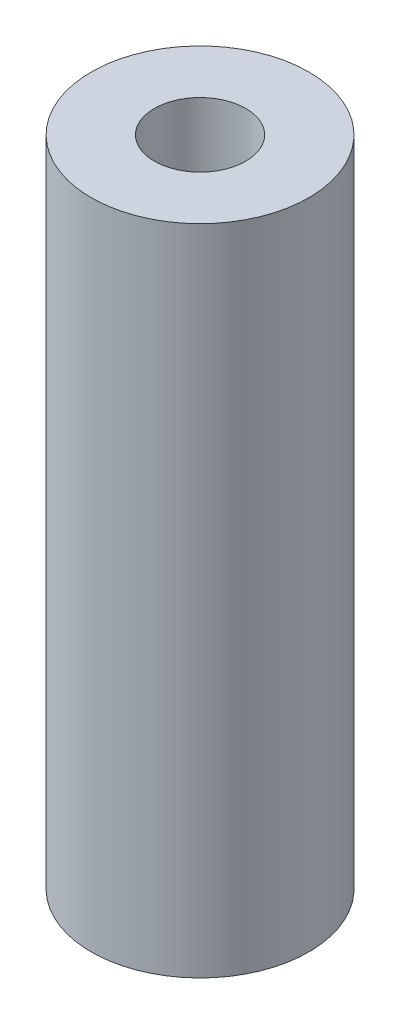
ISO-10303-21;
HEADER;
FILE_DESCRIPTION(('STEP AP214'),'2;1');
FILE_NAME('part.step','',(''),(''),'','','');
FILE_SCHEMA(('AUTOMOTIVE_DESIGN { 1 0 10303 214 1 1 1 1 }'));
ENDSEC;
DATA;
#1=APPLICATION_CONTEXT('core data for automotive mechanical design processes');
#2=APPLICATION_PROTOCOL_DEFINITION('international standard','automotive_design',2000,#1);
#3=PRODUCT_CONTEXT('',#1,'mechanical');
#4=PRODUCT('Part','Part','',(#3));
#5=PRODUCT_RELATED_PRODUCT_CATEGORY('part','',(#4));
#6=PRODUCT_DEFINITION_FORMATION('','',#4);
#7=PRODUCT_DEFINITION_CONTEXT('part definition',#1,'design');
#8=PRODUCT_DEFINITION('design','',#6,#7);
#9=PRODUCT_DEFINITION_SHAPE('','',#8);
#10=(LENGTH_UNIT() NAMED_UNIT(*) SI_UNIT(.MILLI.,.METRE.));
#11=(NAMED_UNIT(*) PLANE_ANGLE_UNIT() SI_UNIT($,.RADIAN.));
#12=(NAMED_UNIT(*) SI_UNIT($,.STERADIAN.) SOLID_ANGLE_UNIT());
#13=UNCERTAINTY_MEASURE_WITH_UNIT(LENGTH_MEASURE(1.E-05),#10,'distance_accuracy_value','');
#14=(GEOMETRIC_REPRESENTATION_CONTEXT(3) GLOBAL_UNCERTAINTY_ASSIGNED_CONTEXT((#13)) GLOBAL_UNIT_ASSIGNED_CONTEXT((#10,
#11,#12)) REPRESENTATION_CONTEXT('',''));
#15=CARTESIAN_POINT('',(0.,0.,0.));
#16=DIRECTION('',(0.,0.,1.));
#17=DIRECTION('',(1.,0.,0.));
#18=AXIS2_PLACEMENT_3D('',#15,#16,#17);
#19=CARTESIAN_POINT('',(0.,38.1,0.));
#20=DIRECTION('',(0.,1.,0.));
#21=DIRECTION('',(0.,0.,1.));
#22=AXIS2_PLACEMENT_3D('',#19,#20,#21);
#23=PLANE('',#22);
#24=CARTESIAN_POINT('',(0.,38.1,0.));
#25=DIRECTION('',(0.,1.,0.));
#26=DIRECTION('',(0.,0.,1.));
#27=AXIS2_PLACEMENT_3D('',#24,#25,#26);
#28=CIRCLE('',#27,6.35);
#29=CARTESIAN_POINT('',(0.,38.1,-6.35));
#30=VERTEX_POINT('',#29);
#31=EDGE_CURVE('E10',#30,#30,#28,.T.);
#32=ORIENTED_EDGE('',*,*,#31,.T.);
#33=EDGE_LOOP('',(#32));
#34=FACE_BOUND('',#33,.T.);
#35=CARTESIAN_POINT('',(0.,38.1,0.));
#36=DIRECTION('',(0.,1.,0.));
#37=DIRECTION('',(0.,0.,1.));
#38=AXIS2_PLACEMENT_3D('',#35,#36,#37);
#39=CIRCLE('',#38,2.667);
#40=CARTESIAN_POINT('',(0.,38.1,-2.667));
#41=VERTEX_POINT('',#40);
#42=EDGE_CURVE('E46',#41,#41,#39,.T.);
#43=ORIENTED_EDGE('',*,*,#42,.F.);
#44=EDGE_LOOP('',(#43));
#45=FACE_BOUND('',#44,.T.);
#46=ADVANCED_FACE('F35',(#34,#45),#23,.T.);
#47=CARTESIAN_POINT('',(0.,0.,0.));
#48=DIRECTION('',(0.,1.,0.));
#49=DIRECTION('',(0.,0.,1.));
#50=AXIS2_PLACEMENT_3D('',#47,#48,#49);
#51=PLANE('',#50);
#52=CARTESIAN_POINT('',(0.,0.,0.));
#53=DIRECTION('',(0.,1.,0.));
#54=DIRECTION('',(0.,0.,1.));
#55=AXIS2_PLACEMENT_3D('',#52,#53,#54);
#56=CIRCLE('',#55,6.35);
#57=CARTESIAN_POINT('',(0.,0.,-6.35));
#58=VERTEX_POINT('',#57);
#59=EDGE_CURVE('E39',#58,#58,#56,.T.);
#60=ORIENTED_EDGE('',*,*,#59,.F.);
#61=EDGE_LOOP('',(#60));
#62=FACE_BOUND('',#61,.T.);
#63=CARTESIAN_POINT('',(0.,0.,0.));
#64=DIRECTION('',(0.,1.,0.));
#65=DIRECTION('',(0.,0.,1.));
#66=AXIS2_PLACEMENT_3D('',#63,#64,#65);
#67=CIRCLE('',#66,2.667);
#68=CARTESIAN_POINT('',(0.,0.,-2.667));
#69=VERTEX_POINT('',#68);
#70=EDGE_CURVE('E48',#69,#69,#67,.T.);
#71=ORIENTED_EDGE('',*,*,#70,.T.);
#72=EDGE_LOOP('',(#71));
#73=FACE_BOUND('',#72,.T.);
#74=ADVANCED_FACE('F58',(#62,#73),#51,.F.);
#75=CARTESIAN_POINT('',(0.,38.1,0.));
#76=DIRECTION('',(0.,-1.,0.));
#77=DIRECTION('',(0.,0.,-1.));
#78=AXIS2_PLACEMENT_3D('',#75,#76,#77);
#79=CYLINDRICAL_SURFACE('',#78,6.35);
#80=CARTESIAN_POINT('',(0.,38.1,-6.35));
#81=CARTESIAN_POINT('',(0.,37.703125,-6.35));
#82=CARTESIAN_POINT('',(0.,37.30625,-6.35));
#83=CARTESIAN_POINT('',(0.,36.5125,-6.35));
#84=CARTESIAN_POINT('',(0.,36.115625,-6.35));
#85=CARTESIAN_POINT('',(0.,35.321875,-6.35));
#86=CARTESIAN_POINT('',(0.,34.925,-6.35));
#87=CARTESIAN_POINT('',(0.,34.13125,-6.35));
#88=CARTESIAN_POINT('',(0.,33.734375,-6.35));
#89=CARTESIAN_POINT('',(0.,32.940625,-6.35));
#90=CARTESIAN_POINT('',(0.,32.54375,-6.35));
#91=CARTESIAN_POINT('',(0.,31.75,-6.35));
#92=CARTESIAN_POINT('',(0.,31.353125,-6.35));
#93=CARTESIAN_POINT('',(0.,30.559375,-6.35));
#94=CARTESIAN_POINT('',(0.,30.1625,-6.35));
#95=CARTESIAN_POINT('',(0.,29.36875,-6.35));
#96=CARTESIAN_POINT('',(0.,28.971875,-6.35));
#97=CARTESIAN_POINT('',(0.,28.178125,-6.35));
#98=CARTESIAN_POINT('',(0.,27.78125,-6.35));
#99=CARTESIAN_POINT('',(0.,26.9875,-6.35));
#100=CARTESIAN_POINT('',(0.,26.590625,-6.35));
#101=CARTESIAN_POINT('',(0.,25.796875,-6.35));
#102=CARTESIAN_POINT('',(0.,25.4,-6.35));
#103=CARTESIAN_POINT('',(0.,24.60625,-6.35));
#104=CARTESIAN_POINT('',(0.,24.209375,-6.35));
#105=CARTESIAN_POINT('',(0.,23.415625,-6.35));
#106=CARTESIAN_POINT('',(0.,23.01875,-6.35));
#107=CARTESIAN_POINT('',(0.,22.225,-6.35));
#108=CARTESIAN_POINT('',(0.,21.828125,-6.35));
#109=CARTESIAN_POINT('',(0.,21.034375,-6.35));
#110=CARTESIAN_POINT('',(0.,20.6375,-6.35));
#111=CARTESIAN_POINT('',(0.,19.84375,-6.35));
#112=CARTESIAN_POINT('',(0.,19.446875,-6.35));
#113=CARTESIAN_POINT('',(0.,18.653125,-6.35));
#114=CARTESIAN_POINT('',(0.,18.25625,-6.35));
#115=CARTESIAN_POINT('',(0.,17.4625,-6.35));
#116=CARTESIAN_POINT('',(0.,17.065625,-6.35));
#117=CARTESIAN_POINT('',(0.,16.271875,-6.35));
#118=CARTESIAN_POINT('',(0.,15.875,-6.35));
#119=CARTESIAN_POINT('',(0.,15.08125,-6.35));
#120=CARTESIAN_POINT('',(0.,14.684375,-6.35));
#121=CARTESIAN_POINT('',(0.,13.890625,-6.35));
#122=CARTESIAN_POINT('',(0.,13.49375,-6.35));
#123=CARTESIAN_POINT('',(0.,12.7,-6.35));
#124=CARTESIAN_POINT('',(0.,12.303125,-6.35));
#125=CARTESIAN_POINT('',(0.,11.509375,-6.35));
#126=CARTESIAN_POINT('',(0.,11.1125,-6.35));
#127=CARTESIAN_POINT('',(0.,10.31875,-6.35));
#128=CARTESIAN_POINT('',(0.,9.921875,-6.35));
#129=CARTESIAN_POINT('',(0.,9.128125,-6.35));
#130=CARTESIAN_POINT('',(0.,8.73125,-6.35));
#131=CARTESIAN_POINT('',(0.,7.9375,-6.35));
#132=CARTESIAN_POINT('',(0.,7.540625,-6.35));
#133=CARTESIAN_POINT('',(0.,6.746875,-6.35));
#134=CARTESIAN_POINT('',(0.,6.35,-6.35));
#135=CARTESIAN_POINT('',(0.,5.55625,-6.35));
#136=CARTESIAN_POINT('',(0.,5.159375,-6.35));
#137=CARTESIAN_POINT('',(0.,4.365625,-6.35));
#138=CARTESIAN_POINT('',(0.,3.96875,-6.35));
#139=CARTESIAN_POINT('',(0.,3.175,-6.35));
#140=CARTESIAN_POINT('',(0.,2.778125,-6.35));
#141=CARTESIAN_POINT('',(0.,1.984375,-6.35));
#142=CARTESIAN_POINT('',(0.,1.5875,-6.35));
#143=CARTESIAN_POINT('',(0.,0.79375,-6.35));
#144=CARTESIAN_POINT('',(0.,0.396875,-6.35));
#145=CARTESIAN_POINT('',(0.,0.,-6.35));
#146=B_SPLINE_CURVE_WITH_KNOTS('',3,(#80,#81,#82,#83,#84,#85,#86,#87,#88,#89,#90,#91,#92,#93,
#94,#95,#96,#97,#98,#99,#100,#101,#102,#103,#104,#105,#106,#107,#108,#109,#110,#111,#112,#113,
#114,#115,#116,#117,#118,#119,#120,#121,#122,#123,#124,#125,#126,#127,#128,#129,#130,#131,#132,
#133,#134,#135,#136,#137,#138,#139,#140,#141,#142,#143,#144,#145),.UNSPECIFIED.,.F.,.F.,(4,2,2,
2,2,2,2,2,2,2,2,2,2,2,2,2,2,2,2,2,2,2,2,2,2,2,2,2,2,2,2,2,4),(0.,1.19062499999999,
2.38124999999999,3.571875,4.7625,5.953125,7.14375,8.33437499999999,9.525,10.715625,11.90625,
13.096875,14.2875,15.478125,16.66875,17.859375,19.05,20.240625,21.43125,22.621875,23.8125,
25.003125,26.19375,27.384375,28.575,29.765625,30.95625,32.146875,33.3375,34.528125,35.71875,
36.909375,38.1),.UNSPECIFIED.);
#147=EDGE_CURVE('BSEAM37',#30,#58,#146,.T.);
#148=ORIENTED_EDGE('',*,*,#31,.F.);
#149=ORIENTED_EDGE('',*,*,#59,.T.);
#150=ORIENTED_EDGE('',*,*,#147,.T.);
#151=ORIENTED_EDGE('',*,*,#147,.F.);
#152=EDGE_LOOP('',(#148,#150,#149,#151));
#153=FACE_BOUND('',#152,.T.);
#154=ADVANCED_FACE('F37',(#153),#79,.T.);
#155=CARTESIAN_POINT('',(0.,38.1,0.));
#156=DIRECTION('',(0.,-1.,0.));
#157=DIRECTION('',(0.,0.,-1.));
#158=AXIS2_PLACEMENT_3D('',#155,#156,#157);
#159=CYLINDRICAL_SURFACE('',#158,2.667);
#160=CARTESIAN_POINT('',(0.,38.1,-2.667));
#161=CARTESIAN_POINT('',(0.,37.703125,-2.667));
#162=CARTESIAN_POINT('',(0.,37.30625,-2.667));
#163=CARTESIAN_POINT('',(0.,36.5125,-2.667));
#164=CARTESIAN_POINT('',(0.,36.115625,-2.667));
#165=CARTESIAN_POINT('',(0.,35.321875,-2.667));
#166=CARTESIAN_POINT('',(0.,34.925,-2.667));
#167=CARTESIAN_POINT('',(0.,34.13125,-2.667));
#168=CARTESIAN_POINT('',(0.,33.734375,-2.667));
#169=CARTESIAN_POINT('',(0.,32.940625,-2.667));
#170=CARTESIAN_POINT('',(0.,32.54375,-2.667));
#171=CARTESIAN_POINT('',(0.,31.75,-2.667));
#172=CARTESIAN_POINT('',(0.,31.353125,-2.667));
#173=CARTESIAN_POINT('',(0.,30.559375,-2.667));
#174=CARTESIAN_POINT('',(0.,30.1625,-2.667));
#175=CARTESIAN_POINT('',(0.,29.36875,-2.667));
#176=CARTESIAN_POINT('',(0.,28.971875,-2.667));
#177=CARTESIAN_POINT('',(0.,28.178125,-2.667));
#178=CARTESIAN_POINT('',(0.,27.78125,-2.667));
#179=CARTESIAN_POINT('',(0.,26.9875,-2.667));
#180=CARTESIAN_POINT('',(0.,26.590625,-2.667));
#181=CARTESIAN_POINT('',(0.,25.796875,-2.667));
#182=CARTESIAN_POINT('',(0.,25.4,-2.667));
#183=CARTESIAN_POINT('',(0.,24.60625,-2.667));
#184=CARTESIAN_POINT('',(0.,24.209375,-2.667));
#185=CARTESIAN_POINT('',(0.,23.415625,-2.667));
#186=CARTESIAN_POINT('',(0.,23.01875,-2.667));
#187=CARTESIAN_POINT('',(0.,22.225,-2.667));
#188=CARTESIAN_POINT('',(0.,21.828125,-2.667));
#189=CARTESIAN_POINT('',(0.,21.034375,-2.667));
#190=CARTESIAN_POINT('',(0.,20.6375,-2.667));
#191=CARTESIAN_POINT('',(0.,19.84375,-2.667));
#192=CARTESIAN_POINT('',(0.,19.446875,-2.667));
#193=CARTESIAN_POINT('',(0.,18.653125,-2.667));
#194=CARTESIAN_POINT('',(0.,18.25625,-2.667));
#195=CARTESIAN_POINT('',(0.,17.4625,-2.667));
#196=CARTESIAN_POINT('',(0.,17.065625,-2.667));
#197=CARTESIAN_POINT('',(0.,16.271875,-2.667));
#198=CARTESIAN_POINT('',(0.,15.875,-2.667));
#199=CARTESIAN_POINT('',(0.,15.08125,-2.667));
#200=CARTESIAN_POINT('',(0.,14.684375,-2.667));
#201=CARTESIAN_POINT('',(0.,13.890625,-2.667));
#202=CARTESIAN_POINT('',(0.,13.49375,-2.667));
#203=CARTESIAN_POINT('',(0.,12.7,-2.667));
#204=CARTESIAN_POINT('',(0.,12.303125,-2.667));
#205=CARTESIAN_POINT('',(0.,11.509375,-2.667));
#206=CARTESIAN_POINT('',(0.,11.1125,-2.667));
#207=CARTESIAN_POINT('',(0.,10.31875,-2.667));
#208=CARTESIAN_POINT('',(0.,9.921875,-2.667));
#209=CARTESIAN_POINT('',(0.,9.128125,-2.667));
#210=CARTESIAN_POINT('',(0.,8.73125,-2.667));
#211=CARTESIAN_POINT('',(0.,7.9375,-2.667));
#212=CARTESIAN_POINT('',(0.,7.540625,-2.667));
#213=CARTESIAN_POINT('',(0.,6.746875,-2.667));
#214=CARTESIAN_POINT('',(0.,6.35,-2.667));
#215=CARTESIAN_POINT('',(0.,5.55625,-2.667));
#216=CARTESIAN_POINT('',(0.,5.159375,-2.667));
#217=CARTESIAN_POINT('',(0.,4.365625,-2.667));
#218=CARTESIAN_POINT('',(0.,3.96875,-2.667));
#219=CARTESIAN_POINT('',(0.,3.175,-2.667));
#220=CARTESIAN_POINT('',(0.,2.778125,-2.667));
#221=CARTESIAN_POINT('',(0.,1.984375,-2.667));
#222=CARTESIAN_POINT('',(0.,1.5875,-2.667));
#223=CARTESIAN_POINT('',(0.,0.79375,-2.667));
#224=CARTESIAN_POINT('',(0.,0.396875,-2.667));
#225=CARTESIAN_POINT('',(0.,0.,-2.667));
#226=B_SPLINE_CURVE_WITH_KNOTS('',3,(#160,#161,#162,#163,#164,#165,#166,#167,#168,#169,#170,
#171,#172,#173,#174,#175,#176,#177,#178,#179,#180,#181,#182,#183,#184,#185,#186,#187,#188,#189,
#190,#191,#192,#193,#194,#195,#196,#197,#198,#199,#200,#201,#202,#203,#204,#205,#206,#207,#208,
#209,#210,#211,#212,#213,#214,#215,#216,#217,#218,#219,#220,#221,#222,#223,#224,#225),
.UNSPECIFIED.,.F.,.F.,(4,2,2,2,2,2,2,2,2,2,2,2,2,2,2,2,2,2,2,2,2,2,2,2,2,2,2,2,2,2,2,2,4),(0.,
1.19062499999999,2.38124999999999,3.571875,4.7625,5.953125,7.14375,8.33437499999999,9.525,
10.715625,11.90625,13.096875,14.2875,15.478125,16.66875,17.859375,19.05,20.240625,21.43125,
22.621875,23.8125,25.003125,26.19375,27.384375,28.575,29.765625,30.95625,32.146875,33.3375,
34.528125,35.71875,36.909375,38.1),.UNSPECIFIED.);
#227=EDGE_CURVE('BSEAM54',#41,#69,#226,.T.);
#228=ORIENTED_EDGE('',*,*,#42,.T.);
#229=ORIENTED_EDGE('',*,*,#70,.F.);
#230=ORIENTED_EDGE('',*,*,#227,.T.);
#231=ORIENTED_EDGE('',*,*,#227,.F.);
#232=EDGE_LOOP('',(#228,#230,#229,#231));
#233=FACE_BOUND('',#232,.T.);
#234=ADVANCED_FACE('F54',(#233),#159,.F.);
#235=CLOSED_SHELL('',(#46,#74,#154,#234));
#236=MANIFOLD_SOLID_BREP('B2',#235);
#237=ADVANCED_BREP_SHAPE_REPRESENTATION('',(#18,#236),#14);
#238=SHAPE_DEFINITION_REPRESENTATION(#9,#237);
ENDSEC;
END-ISO-10303-21;
